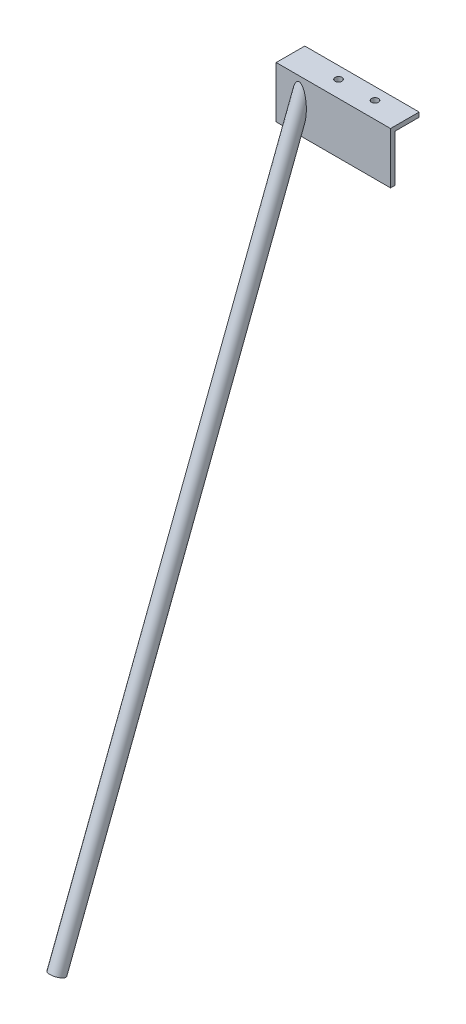
ISO-10303-21;
HEADER;
FILE_DESCRIPTION(('STEP AP214'),'2;1');
FILE_NAME('part.step','',(''),(''),'','','');
FILE_SCHEMA(('AUTOMOTIVE_DESIGN { 1 0 10303 214 1 1 1 1 }'));
ENDSEC;
DATA;
#1=APPLICATION_CONTEXT('core data for automotive mechanical design processes');
#2=APPLICATION_PROTOCOL_DEFINITION('international standard','automotive_design',2000,#1);
#3=PRODUCT_CONTEXT('',#1,'mechanical');
#4=PRODUCT('Part','Part','',(#3));
#5=PRODUCT_RELATED_PRODUCT_CATEGORY('part','',(#4));
#6=PRODUCT_DEFINITION_FORMATION('','',#4);
#7=PRODUCT_DEFINITION_CONTEXT('part definition',#1,'design');
#8=PRODUCT_DEFINITION('design','',#6,#7);
#9=PRODUCT_DEFINITION_SHAPE('','',#8);
#10=(LENGTH_UNIT() NAMED_UNIT(*) SI_UNIT(.MILLI.,.METRE.));
#11=(NAMED_UNIT(*) PLANE_ANGLE_UNIT() SI_UNIT($,.RADIAN.));
#12=(NAMED_UNIT(*) SI_UNIT($,.STERADIAN.) SOLID_ANGLE_UNIT());
#13=UNCERTAINTY_MEASURE_WITH_UNIT(LENGTH_MEASURE(1.E-05),#10,'distance_accuracy_value','');
#14=(GEOMETRIC_REPRESENTATION_CONTEXT(3) GLOBAL_UNCERTAINTY_ASSIGNED_CONTEXT((#13)) GLOBAL_UNIT_ASSIGNED_CONTEXT((#10,
#11,#12)) REPRESENTATION_CONTEXT('',''));
#15=CARTESIAN_POINT('',(0.,0.,0.));
#16=DIRECTION('',(0.,0.,1.));
#17=DIRECTION('',(1.,0.,0.));
#18=AXIS2_PLACEMENT_3D('',#15,#16,#17);
#19=CARTESIAN_POINT('',(100.,-45.,0.));
#20=DIRECTION('',(0.,0.,-1.));
#21=DIRECTION('',(-1.,0.,0.));
#22=AXIS2_PLACEMENT_3D('',#19,#20,#21);
#23=PLANE('',#22);
#24=CARTESIAN_POINT('',(20.,-22.3234248770024,0.));
#25=DIRECTION('',(0.,0.,-1.));
#26=DIRECTION('',(0.,-1.,0.));
#27=AXIS2_PLACEMENT_3D('',#24,#25,#26);
#28=ELLIPSE('',#27,17.7889791988613,6.375);
#29=CARTESIAN_POINT('',(20.,-40.1124040758638,0.));
#30=VERTEX_POINT('',#29);
#31=EDGE_CURVE('E153',#30,#30,#28,.T.);
#32=ORIENTED_EDGE('',*,*,#31,.T.);
#33=EDGE_LOOP('',(#32));
#34=FACE_BOUND('',#33,.T.);
#35=DIRECTION('',(0.,-1.,0.));
#36=VECTOR('',#35,1.);
#37=CARTESIAN_POINT('',(0.,-45.,0.));
#38=LINE('',#37,#36);
#39=CARTESIAN_POINT('',(0.,0.,0.));
#40=VERTEX_POINT('',#39);
#41=CARTESIAN_POINT('',(0.,-45.,0.));
#42=VERTEX_POINT('',#41);
#43=EDGE_CURVE('E118',#40,#42,#38,.T.);
#44=ORIENTED_EDGE('',*,*,#43,.T.);
#45=DIRECTION('',(-1.,0.,0.));
#46=VECTOR('',#45,1.);
#47=CARTESIAN_POINT('',(100.,-45.,0.));
#48=LINE('',#47,#46);
#49=CARTESIAN_POINT('',(100.,-45.,0.));
#50=VERTEX_POINT('',#49);
#51=EDGE_CURVE('E41',#50,#42,#48,.T.);
#52=ORIENTED_EDGE('',*,*,#51,.F.);
#53=DIRECTION('',(0.,-1.,0.));
#54=VECTOR('',#53,1.);
#55=CARTESIAN_POINT('',(100.,-45.,0.));
#56=LINE('',#55,#54);
#57=CARTESIAN_POINT('',(100.,0.,0.));
#58=VERTEX_POINT('',#57);
#59=EDGE_CURVE('E129',#58,#50,#56,.T.);
#60=ORIENTED_EDGE('',*,*,#59,.F.);
#61=DIRECTION('',(-1.,0.,0.));
#62=VECTOR('',#61,1.);
#63=CARTESIAN_POINT('',(100.,0.,0.));
#64=LINE('',#63,#62);
#65=EDGE_CURVE('E114',#58,#40,#64,.T.);
#66=ORIENTED_EDGE('',*,*,#65,.T.);
#67=EDGE_LOOP('',(#44,#52,#60,#66));
#68=FACE_BOUND('',#67,.T.);
#69=ADVANCED_FACE('F33',(#34,#68),#23,.F.);
#70=CARTESIAN_POINT('',(100.,-45.,-4.));
#71=DIRECTION('',(0.,1.,0.));
#72=DIRECTION('',(0.,0.,1.));
#73=AXIS2_PLACEMENT_3D('',#70,#71,#72);
#74=PLANE('',#73);
#75=DIRECTION('',(0.,0.,-1.));
#76=VECTOR('',#75,1.);
#77=CARTESIAN_POINT('',(0.,-45.,-4.));
#78=LINE('',#77,#76);
#79=CARTESIAN_POINT('',(0.,-45.,-4.));
#80=VERTEX_POINT('',#79);
#81=EDGE_CURVE('E121',#42,#80,#78,.T.);
#82=ORIENTED_EDGE('',*,*,#81,.T.);
#83=DIRECTION('',(-1.,0.,0.));
#84=VECTOR('',#83,1.);
#85=CARTESIAN_POINT('',(100.,-45.,-4.));
#86=LINE('',#85,#84);
#87=CARTESIAN_POINT('',(100.,-45.,-4.));
#88=VERTEX_POINT('',#87);
#89=EDGE_CURVE('E133',#88,#80,#86,.T.);
#90=ORIENTED_EDGE('',*,*,#89,.F.);
#91=DIRECTION('',(0.,0.,-1.));
#92=VECTOR('',#91,1.);
#93=CARTESIAN_POINT('',(100.,-45.,-4.));
#94=LINE('',#93,#92);
#95=EDGE_CURVE('E87',#50,#88,#94,.T.);
#96=ORIENTED_EDGE('',*,*,#95,.F.);
#97=ORIENTED_EDGE('',*,*,#51,.T.);
#98=EDGE_LOOP('',(#82,#90,#96,#97));
#99=FACE_BOUND('',#98,.T.);
#100=ADVANCED_FACE('F136',(#99),#74,.F.);
#101=CARTESIAN_POINT('',(100.,-4.,-4.));
#102=DIRECTION('',(0.,0.,1.));
#103=DIRECTION('',(0.,-1.,0.));
#104=AXIS2_PLACEMENT_3D('',#101,#102,#103);
#105=PLANE('',#104);
#106=DIRECTION('',(0.,1.,0.));
#107=VECTOR('',#106,1.);
#108=CARTESIAN_POINT('',(0.,-4.,-4.));
#109=LINE('',#108,#107);
#110=CARTESIAN_POINT('',(0.,-4.,-4.));
#111=VERTEX_POINT('',#110);
#112=EDGE_CURVE('E124',#80,#111,#109,.T.);
#113=ORIENTED_EDGE('',*,*,#112,.T.);
#114=DIRECTION('',(-1.,0.,0.));
#115=VECTOR('',#114,1.);
#116=CARTESIAN_POINT('',(100.,-4.,-4.));
#117=LINE('',#116,#115);
#118=CARTESIAN_POINT('',(100.,-4.,-4.));
#119=VERTEX_POINT('',#118);
#120=EDGE_CURVE('E109',#119,#111,#117,.T.);
#121=ORIENTED_EDGE('',*,*,#120,.F.);
#122=DIRECTION('',(0.,1.,0.));
#123=VECTOR('',#122,1.);
#124=CARTESIAN_POINT('',(100.,-4.,-4.));
#125=LINE('',#124,#123);
#126=EDGE_CURVE('E100',#88,#119,#125,.T.);
#127=ORIENTED_EDGE('',*,*,#126,.F.);
#128=ORIENTED_EDGE('',*,*,#89,.T.);
#129=EDGE_LOOP('',(#113,#121,#127,#128));
#130=FACE_BOUND('',#129,.T.);
#131=ADVANCED_FACE('F144',(#130),#105,.F.);
#132=CARTESIAN_POINT('',(100.,-4.,-25.));
#133=DIRECTION('',(0.,1.,0.));
#134=DIRECTION('',(0.,0.,1.));
#135=AXIS2_PLACEMENT_3D('',#132,#133,#134);
#136=PLANE('',#135);
#137=CARTESIAN_POINT('',(40.,-4.,-14.5));
#138=DIRECTION('',(0.,1.,0.));
#139=DIRECTION('',(0.,0.,1.));
#140=AXIS2_PLACEMENT_3D('',#137,#138,#139);
#141=CIRCLE('',#140,2.99999999999993);
#142=CARTESIAN_POINT('',(40.,-4.,-11.5000000000001));
#143=VERTEX_POINT('',#142);
#144=EDGE_CURVE('E162',#143,#143,#141,.T.);
#145=ORIENTED_EDGE('',*,*,#144,.T.);
#146=EDGE_LOOP('',(#145));
#147=FACE_BOUND('',#146,.T.);
#148=CARTESIAN_POINT('',(71.89,-4.,-14.5));
#149=DIRECTION('',(0.,1.,0.));
#150=DIRECTION('',(0.,0.,1.));
#151=AXIS2_PLACEMENT_3D('',#148,#149,#150);
#152=CIRCLE('',#151,2.99999999999993);
#153=CARTESIAN_POINT('',(71.89,-4.,-11.5000000000001));
#154=VERTEX_POINT('',#153);
#155=EDGE_CURVE('E156',#154,#154,#152,.T.);
#156=ORIENTED_EDGE('',*,*,#155,.T.);
#157=EDGE_LOOP('',(#156));
#158=FACE_BOUND('',#157,.T.);
#159=DIRECTION('',(0.,0.,-1.));
#160=VECTOR('',#159,1.);
#161=CARTESIAN_POINT('',(0.,-4.,-25.));
#162=LINE('',#161,#160);
#163=CARTESIAN_POINT('',(0.,-4.,-25.));
#164=VERTEX_POINT('',#163);
#165=EDGE_CURVE('E108',#111,#164,#162,.T.);
#166=ORIENTED_EDGE('',*,*,#165,.T.);
#167=DIRECTION('',(-1.,0.,0.));
#168=VECTOR('',#167,1.);
#169=CARTESIAN_POINT('',(100.,-4.,-25.));
#170=LINE('',#169,#168);
#171=CARTESIAN_POINT('',(100.,-4.,-25.));
#172=VERTEX_POINT('',#171);
#173=EDGE_CURVE('E105',#172,#164,#170,.T.);
#174=ORIENTED_EDGE('',*,*,#173,.F.);
#175=DIRECTION('',(0.,0.,-1.));
#176=VECTOR('',#175,1.);
#177=CARTESIAN_POINT('',(100.,-4.,-25.));
#178=LINE('',#177,#176);
#179=EDGE_CURVE('E94',#119,#172,#178,.T.);
#180=ORIENTED_EDGE('',*,*,#179,.F.);
#181=ORIENTED_EDGE('',*,*,#120,.T.);
#182=EDGE_LOOP('',(#166,#174,#180,#181));
#183=FACE_BOUND('',#182,.T.);
#184=ADVANCED_FACE('F106',(#147,#158,#183),#136,.F.);
#185=CARTESIAN_POINT('',(100.,0.,-25.));
#186=DIRECTION('',(0.,0.,1.));
#187=DIRECTION('',(1.,0.,0.));
#188=AXIS2_PLACEMENT_3D('',#185,#186,#187);
#189=PLANE('',#188);
#190=DIRECTION('',(0.,1.,0.));
#191=VECTOR('',#190,1.);
#192=CARTESIAN_POINT('',(0.,0.,-25.));
#193=LINE('',#192,#191);
#194=CARTESIAN_POINT('',(0.,0.,-25.));
#195=VERTEX_POINT('',#194);
#196=EDGE_CURVE('E72',#164,#195,#193,.T.);
#197=ORIENTED_EDGE('',*,*,#196,.T.);
#198=DIRECTION('',(-1.,0.,0.));
#199=VECTOR('',#198,1.);
#200=CARTESIAN_POINT('',(100.,0.,-25.));
#201=LINE('',#200,#199);
#202=CARTESIAN_POINT('',(100.,0.,-25.));
#203=VERTEX_POINT('',#202);
#204=EDGE_CURVE('E110',#203,#195,#201,.T.);
#205=ORIENTED_EDGE('',*,*,#204,.F.);
#206=DIRECTION('',(0.,1.,0.));
#207=VECTOR('',#206,1.);
#208=CARTESIAN_POINT('',(100.,0.,-25.));
#209=LINE('',#208,#207);
#210=EDGE_CURVE('E98',#172,#203,#209,.T.);
#211=ORIENTED_EDGE('',*,*,#210,.F.);
#212=ORIENTED_EDGE('',*,*,#173,.T.);
#213=EDGE_LOOP('',(#197,#205,#211,#212));
#214=FACE_BOUND('',#213,.T.);
#215=ADVANCED_FACE('F112',(#214),#189,.F.);
#216=CARTESIAN_POINT('',(100.,0.,0.));
#217=DIRECTION('',(0.,-1.,0.));
#218=DIRECTION('',(0.,0.,-1.));
#219=AXIS2_PLACEMENT_3D('',#216,#217,#218);
#220=PLANE('',#219);
#221=CARTESIAN_POINT('',(40.,0.,-14.5));
#222=DIRECTION('',(0.,1.,0.));
#223=DIRECTION('',(0.,0.,1.));
#224=AXIS2_PLACEMENT_3D('',#221,#222,#223);
#225=CIRCLE('',#224,3.);
#226=CARTESIAN_POINT('',(40.,0.,-11.5));
#227=VERTEX_POINT('',#226);
#228=EDGE_CURVE('E165',#227,#227,#225,.T.);
#229=ORIENTED_EDGE('',*,*,#228,.F.);
#230=EDGE_LOOP('',(#229));
#231=FACE_BOUND('',#230,.T.);
#232=CARTESIAN_POINT('',(71.89,0.,-14.5));
#233=DIRECTION('',(0.,1.,0.));
#234=DIRECTION('',(0.,0.,1.));
#235=AXIS2_PLACEMENT_3D('',#232,#233,#234);
#236=CIRCLE('',#235,3.);
#237=CARTESIAN_POINT('',(71.89,0.,-11.5));
#238=VERTEX_POINT('',#237);
#239=EDGE_CURVE('E159',#238,#238,#236,.T.);
#240=ORIENTED_EDGE('',*,*,#239,.F.);
#241=EDGE_LOOP('',(#240));
#242=FACE_BOUND('',#241,.T.);
#243=DIRECTION('',(0.,0.,1.));
#244=VECTOR('',#243,1.);
#245=CARTESIAN_POINT('',(0.,0.,0.));
#246=LINE('',#245,#244);
#247=EDGE_CURVE('E78',#195,#40,#246,.T.);
#248=ORIENTED_EDGE('',*,*,#247,.T.);
#249=ORIENTED_EDGE('',*,*,#65,.F.);
#250=DIRECTION('',(0.,0.,1.));
#251=VECTOR('',#250,1.);
#252=CARTESIAN_POINT('',(100.,0.,0.));
#253=LINE('',#252,#251);
#254=EDGE_CURVE('E49',#203,#58,#253,.T.);
#255=ORIENTED_EDGE('',*,*,#254,.F.);
#256=ORIENTED_EDGE('',*,*,#204,.T.);
#257=EDGE_LOOP('',(#248,#249,#255,#256));
#258=FACE_BOUND('',#257,.T.);
#259=ADVANCED_FACE('F172',(#231,#242,#258),#220,.F.);
#260=CARTESIAN_POINT('',(100.,0.,0.));
#261=DIRECTION('',(-1.,0.,0.));
#262=DIRECTION('',(0.,0.,1.));
#263=AXIS2_PLACEMENT_3D('',#260,#261,#262);
#264=PLANE('',#263);
#265=ORIENTED_EDGE('',*,*,#59,.T.);
#266=ORIENTED_EDGE('',*,*,#95,.T.);
#267=ORIENTED_EDGE('',*,*,#126,.T.);
#268=ORIENTED_EDGE('',*,*,#179,.T.);
#269=ORIENTED_EDGE('',*,*,#210,.T.);
#270=ORIENTED_EDGE('',*,*,#254,.T.);
#271=EDGE_LOOP('',(#265,#266,#267,#268,#269,#270));
#272=FACE_BOUND('',#271,.T.);
#273=ADVANCED_FACE('F96',(#272),#264,.F.);
#274=CARTESIAN_POINT('',(0.,0.,0.));
#275=DIRECTION('',(-1.,0.,0.));
#276=DIRECTION('',(0.,0.,1.));
#277=AXIS2_PLACEMENT_3D('',#274,#275,#276);
#278=PLANE('',#277);
#279=ORIENTED_EDGE('',*,*,#43,.F.);
#280=ORIENTED_EDGE('',*,*,#247,.F.);
#281=ORIENTED_EDGE('',*,*,#196,.F.);
#282=ORIENTED_EDGE('',*,*,#165,.F.);
#283=ORIENTED_EDGE('',*,*,#112,.F.);
#284=ORIENTED_EDGE('',*,*,#81,.F.);
#285=EDGE_LOOP('',(#279,#280,#281,#282,#283,#284));
#286=FACE_BOUND('',#285,.T.);
#287=ADVANCED_FACE('F141',(#286),#278,.T.);
#288=CARTESIAN_POINT('',(20.,-574.228545273008,211.85652647192));
#289=DIRECTION('',(0.,0.9335804264972,-0.358367949545304));
#290=DIRECTION('',(0.,0.358367949545304,0.9335804264972));
#291=AXIS2_PLACEMENT_3D('',#288,#289,#290);
#292=CYLINDRICAL_SURFACE('',#291,6.375);
#293=CARTESIAN_POINT('',(20.,-574.228545273008,211.85652647192));
#294=DIRECTION('',(0.,0.9335804264972,-0.358367949545304));
#295=DIRECTION('',(0.,0.358367949545304,0.9335804264972));
#296=AXIS2_PLACEMENT_3D('',#293,#294,#295);
#297=CIRCLE('',#296,6.375);
#298=CARTESIAN_POINT('',(20.,-571.943949594656,217.80810169084));
#299=VERTEX_POINT('',#298);
#300=EDGE_CURVE('E122',#299,#299,#297,.T.);
#301=ORIENTED_EDGE('',*,*,#300,.T.);
#302=EDGE_LOOP('',(#301));
#303=FACE_BOUND('',#302,.T.);
#304=ORIENTED_EDGE('',*,*,#31,.F.);
#305=EDGE_LOOP('',(#304));
#306=FACE_BOUND('',#305,.T.);
#307=ADVANCED_FACE('F213',(#303,#306),#292,.T.);
#308=CARTESIAN_POINT('',(20.,-574.228545273008,211.85652647192));
#309=DIRECTION('',(0.,0.9335804264972,-0.358367949545304));
#310=DIRECTION('',(0.,0.358367949545304,0.9335804264972));
#311=AXIS2_PLACEMENT_3D('',#308,#309,#310);
#312=PLANE('',#311);
#313=CARTESIAN_POINT('',(20.,-574.228545273008,211.85652647192));
#314=DIRECTION('',(0.,0.9335804264972,-0.358367949545304));
#315=DIRECTION('',(0.,0.358367949545304,0.9335804264972));
#316=AXIS2_PLACEMENT_3D('',#313,#314,#315);
#317=CIRCLE('',#316,4.9);
#318=CARTESIAN_POINT('',(20.,-572.472542320236,216.431070561757));
#319=VERTEX_POINT('',#318);
#320=EDGE_CURVE('E150',#319,#319,#317,.T.);
#321=ORIENTED_EDGE('',*,*,#320,.T.);
#322=EDGE_LOOP('',(#321));
#323=FACE_BOUND('',#322,.T.);
#324=ORIENTED_EDGE('',*,*,#300,.F.);
#325=EDGE_LOOP('',(#324));
#326=FACE_BOUND('',#325,.T.);
#327=ADVANCED_FACE('F205',(#323,#326),#312,.F.);
#328=CARTESIAN_POINT('',(20.,-574.228545273008,211.85652647192));
#329=DIRECTION('',(0.,0.9335804264972,-0.358367949545304));
#330=DIRECTION('',(0.,0.358367949545304,0.9335804264972));
#331=AXIS2_PLACEMENT_3D('',#328,#329,#330);
#332=CYLINDRICAL_SURFACE('',#331,4.9);
#333=ORIENTED_EDGE('',*,*,#320,.F.);
#334=EDGE_LOOP('',(#333));
#335=FACE_BOUND('',#334,.T.);
#336=CARTESIAN_POINT('',(20.,-22.3234248770025,0.));
#337=DIRECTION('',(0.,0.,-1.));
#338=DIRECTION('',(0.,1.,0.));
#339=AXIS2_PLACEMENT_3D('',#336,#337,#338);
#340=ELLIPSE('',#339,13.673097737164,4.9);
#341=CARTESIAN_POINT('',(20.,-8.65032713983844,0.));
#342=VERTEX_POINT('',#341);
#343=EDGE_CURVE('E11',#342,#342,#340,.T.);
#344=ORIENTED_EDGE('',*,*,#343,.T.);
#345=EDGE_LOOP('',(#344));
#346=FACE_BOUND('',#345,.T.);
#347=ADVANCED_FACE('F201',(#335,#346),#332,.F.);
#348=ORIENTED_EDGE('',*,*,#343,.F.);
#349=EDGE_LOOP('',(#348));
#350=FACE_BOUND('',#349,.T.);
#351=ADVANCED_FACE('F181',(#350),#23,.F.);
#352=CARTESIAN_POINT('',(71.89,0.,-14.5));
#353=DIRECTION('',(0.,1.,0.));
#354=DIRECTION('',(0.,0.,1.));
#355=AXIS2_PLACEMENT_3D('',#352,#353,#354);
#356=CYLINDRICAL_SURFACE('',#355,2.99999999999993);
#357=ORIENTED_EDGE('',*,*,#239,.T.);
#358=EDGE_LOOP('',(#357));
#359=FACE_BOUND('',#358,.T.);
#360=ORIENTED_EDGE('',*,*,#155,.F.);
#361=EDGE_LOOP('',(#360));
#362=FACE_BOUND('',#361,.T.);
#363=ADVANCED_FACE('F178',(#359,#362),#356,.F.);
#364=CARTESIAN_POINT('',(40.,0.,-14.5));
#365=DIRECTION('',(0.,1.,0.));
#366=DIRECTION('',(0.,0.,1.));
#367=AXIS2_PLACEMENT_3D('',#364,#365,#366);
#368=CYLINDRICAL_SURFACE('',#367,2.99999999999993);
#369=ORIENTED_EDGE('',*,*,#228,.T.);
#370=EDGE_LOOP('',(#369));
#371=FACE_BOUND('',#370,.T.);
#372=ORIENTED_EDGE('',*,*,#144,.F.);
#373=EDGE_LOOP('',(#372));
#374=FACE_BOUND('',#373,.T.);
#375=ADVANCED_FACE('F169',(#371,#374),#368,.F.);
#376=CLOSED_SHELL('',(#69,#100,#131,#184,#215,#259,#273,#287,#307,#327,#347,#351,#363,#375));
#377=MANIFOLD_SOLID_BREP('B2',#376);
#378=ADVANCED_BREP_SHAPE_REPRESENTATION('',(#18,#377),#14);
#379=SHAPE_DEFINITION_REPRESENTATION(#9,#378);
ENDSEC;
END-ISO-10303-21;
